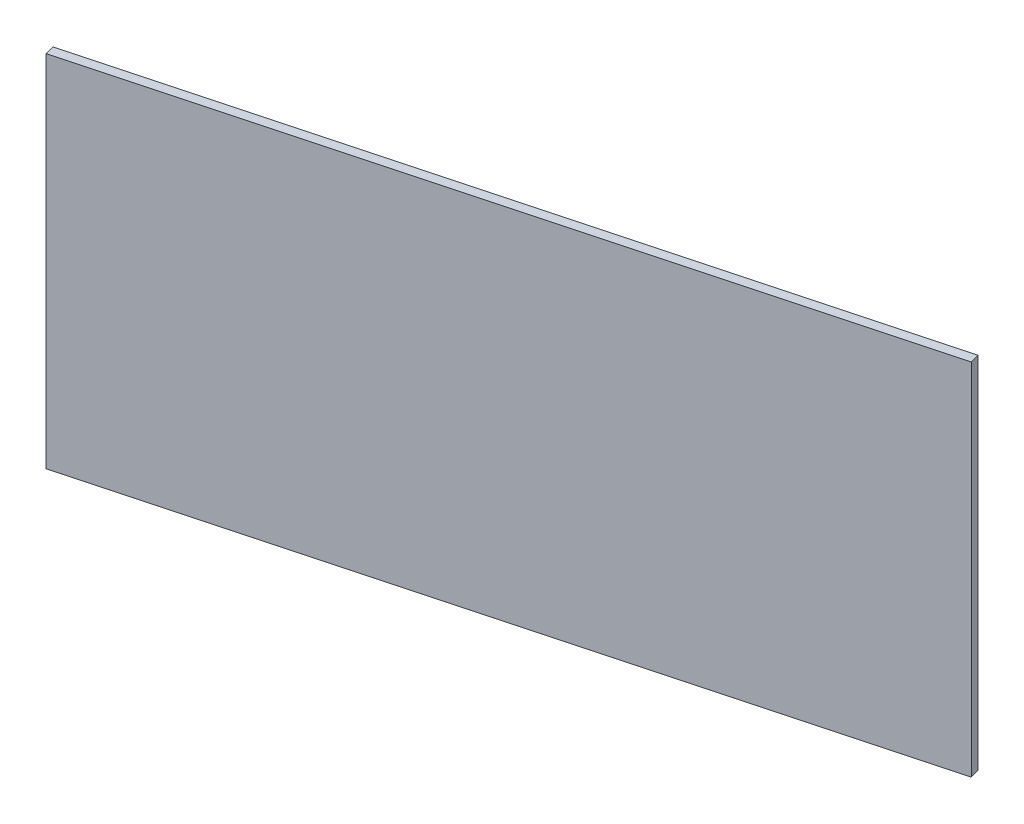
ISO-10303-21;
HEADER;
FILE_DESCRIPTION(('STEP AP214'),'2;1');
FILE_NAME('part.step','',(''),(''),'','','');
FILE_SCHEMA(('AUTOMOTIVE_DESIGN { 1 0 10303 214 1 1 1 1 }'));
ENDSEC;
DATA;
#1=APPLICATION_CONTEXT('core data for automotive mechanical design processes');
#2=APPLICATION_PROTOCOL_DEFINITION('international standard','automotive_design',2000,#1);
#3=PRODUCT_CONTEXT('',#1,'mechanical');
#4=PRODUCT('Part','Part','',(#3));
#5=PRODUCT_RELATED_PRODUCT_CATEGORY('part','',(#4));
#6=PRODUCT_DEFINITION_FORMATION('','',#4);
#7=PRODUCT_DEFINITION_CONTEXT('part definition',#1,'design');
#8=PRODUCT_DEFINITION('design','',#6,#7);
#9=PRODUCT_DEFINITION_SHAPE('','',#8);
#10=(LENGTH_UNIT() NAMED_UNIT(*) SI_UNIT(.MILLI.,.METRE.));
#11=(NAMED_UNIT(*) PLANE_ANGLE_UNIT() SI_UNIT($,.RADIAN.));
#12=(NAMED_UNIT(*) SI_UNIT($,.STERADIAN.) SOLID_ANGLE_UNIT());
#13=UNCERTAINTY_MEASURE_WITH_UNIT(LENGTH_MEASURE(1.E-05),#10,'distance_accuracy_value','');
#14=(GEOMETRIC_REPRESENTATION_CONTEXT(3) GLOBAL_UNCERTAINTY_ASSIGNED_CONTEXT((#13)) GLOBAL_UNIT_ASSIGNED_CONTEXT((#10,
#11,#12)) REPRESENTATION_CONTEXT('',''));
#15=CARTESIAN_POINT('',(0.,0.,0.));
#16=DIRECTION('',(0.,0.,1.));
#17=DIRECTION('',(1.,0.,0.));
#18=AXIS2_PLACEMENT_3D('',#15,#16,#17);
#19=CARTESIAN_POINT('',(13.541543939428,-1721.,3009.138921883));
#20=DIRECTION('',(0.258819045102985,0.,0.965925826288944));
#21=DIRECTION('',(0.,-1.,0.));
#22=AXIS2_PLACEMENT_3D('',#19,#20,#21);
#23=PLANE('',#22);
#24=DIRECTION('',(0.,1.,0.));
#25=VECTOR('',#24,1.);
#26=CARTESIAN_POINT('',(13.541543939428,-1721.,3009.138921883));
#27=LINE('',#26,#25);
#28=CARTESIAN_POINT('',(13.541543939428,-1721.,3009.138921883));
#29=VERTEX_POINT('',#28);
#30=CARTESIAN_POINT('',(13.541543939428,-587.,3009.138921883));
#31=VERTEX_POINT('',#30);
#32=EDGE_CURVE('E75',#29,#31,#27,.T.);
#33=ORIENTED_EDGE('',*,*,#32,.F.);
#34=DIRECTION('',(0.965925826288944,0.,-0.258819045102985));
#35=VECTOR('',#34,1.);
#36=CARTESIAN_POINT('',(13.541543939428,-1721.,3009.138921883));
#37=LINE('',#36,#35);
#38=CARTESIAN_POINT('',(2314.37686216,-1721.,2392.631956449));
#39=VERTEX_POINT('',#38);
#40=EDGE_CURVE('E70',#29,#39,#37,.T.);
#41=ORIENTED_EDGE('',*,*,#40,.T.);
#42=DIRECTION('',(0.,1.,0.));
#43=VECTOR('',#42,1.);
#44=CARTESIAN_POINT('',(2314.37686216,-1721.,2392.631956449));
#45=LINE('',#44,#43);
#46=CARTESIAN_POINT('',(2314.37686216,-587.,2392.631956449));
#47=VERTEX_POINT('',#46);
#48=EDGE_CURVE('E72',#39,#47,#45,.T.);
#49=ORIENTED_EDGE('',*,*,#48,.T.);
#50=DIRECTION('',(0.965925826288944,0.,-0.258819045102985));
#51=VECTOR('',#50,1.);
#52=CARTESIAN_POINT('',(13.541543939428,-587.,3009.138921883));
#53=LINE('',#52,#51);
#54=EDGE_CURVE('E11',#31,#47,#53,.T.);
#55=ORIENTED_EDGE('',*,*,#54,.F.);
#56=EDGE_LOOP('',(#33,#41,#49,#55));
#57=FACE_BOUND('',#56,.T.);
#58=ADVANCED_FACE('F17',(#57),#23,.T.);
#59=CARTESIAN_POINT('',(5.776972586353,-1721.,2980.161147095));
#60=DIRECTION('',(0.258819045102985,0.,0.965925826288944));
#61=DIRECTION('',(0.,-1.,0.));
#62=AXIS2_PLACEMENT_3D('',#59,#60,#61);
#63=PLANE('',#62);
#64=DIRECTION('',(0.965925826288944,0.,-0.258819045102985));
#65=VECTOR('',#64,1.);
#66=CARTESIAN_POINT('',(5.776972586353,-587.,2980.161147095));
#67=LINE('',#66,#65);
#68=CARTESIAN_POINT('',(5.776972586353,-587.,2980.161147095));
#69=VERTEX_POINT('',#68);
#70=CARTESIAN_POINT('',(2306.612290807,-587.,2363.654181661));
#71=VERTEX_POINT('',#70);
#72=EDGE_CURVE('E26',#69,#71,#67,.T.);
#73=ORIENTED_EDGE('',*,*,#72,.T.);
#74=DIRECTION('',(0.,1.,0.));
#75=VECTOR('',#74,1.);
#76=CARTESIAN_POINT('',(2306.612290807,-1721.,2363.654181661));
#77=LINE('',#76,#75);
#78=CARTESIAN_POINT('',(2306.612290807,-1721.,2363.654181661));
#79=VERTEX_POINT('',#78);
#80=EDGE_CURVE('E89',#79,#71,#77,.T.);
#81=ORIENTED_EDGE('',*,*,#80,.F.);
#82=DIRECTION('',(0.965925826288944,0.,-0.258819045102985));
#83=VECTOR('',#82,1.);
#84=CARTESIAN_POINT('',(5.776972586353,-1721.,2980.161147095));
#85=LINE('',#84,#83);
#86=CARTESIAN_POINT('',(5.776972586353,-1721.,2980.161147095));
#87=VERTEX_POINT('',#86);
#88=EDGE_CURVE('E62',#87,#79,#85,.T.);
#89=ORIENTED_EDGE('',*,*,#88,.F.);
#90=DIRECTION('',(0.,1.,0.));
#91=VECTOR('',#90,1.);
#92=CARTESIAN_POINT('',(5.776972586353,-1721.,2980.161147095));
#93=LINE('',#92,#91);
#94=EDGE_CURVE('E96',#87,#69,#93,.T.);
#95=ORIENTED_EDGE('',*,*,#94,.T.);
#96=EDGE_LOOP('',(#73,#81,#89,#95));
#97=FACE_BOUND('',#96,.T.);
#98=ADVANCED_FACE('F128',(#97),#63,.F.);
#99=CARTESIAN_POINT('',(5.776972586353,-587.,2980.161147095));
#100=DIRECTION('',(0.,1.,0.));
#101=DIRECTION('',(1.,0.,0.));
#102=AXIS2_PLACEMENT_3D('',#99,#100,#101);
#103=PLANE('',#102);
#104=ORIENTED_EDGE('',*,*,#72,.F.);
#105=DIRECTION('',(0.258819045102985,0.,0.965925826288944));
#106=VECTOR('',#105,1.);
#107=CARTESIAN_POINT('',(5.776972586353,-587.,2980.161147095));
#108=LINE('',#107,#106);
#109=EDGE_CURVE('E110',#69,#31,#108,.T.);
#110=ORIENTED_EDGE('',*,*,#109,.T.);
#111=ORIENTED_EDGE('',*,*,#54,.T.);
#112=DIRECTION('',(0.258819045102985,0.,0.965925826288944));
#113=VECTOR('',#112,1.);
#114=CARTESIAN_POINT('',(2306.612290807,-587.,2363.654181661));
#115=LINE('',#114,#113);
#116=EDGE_CURVE('E84',#71,#47,#115,.T.);
#117=ORIENTED_EDGE('',*,*,#116,.F.);
#118=EDGE_LOOP('',(#104,#110,#111,#117));
#119=FACE_BOUND('',#118,.T.);
#120=ADVANCED_FACE('F116',(#119),#103,.T.);
#121=CARTESIAN_POINT('',(5.776972586353,-1721.,2980.161147095));
#122=DIRECTION('',(0.,1.,0.));
#123=DIRECTION('',(1.,0.,0.));
#124=AXIS2_PLACEMENT_3D('',#121,#122,#123);
#125=PLANE('',#124);
#126=DIRECTION('',(0.258819045102985,0.,0.965925826288944));
#127=VECTOR('',#126,1.);
#128=CARTESIAN_POINT('',(2306.612290807,-1721.,2363.654181661));
#129=LINE('',#128,#127);
#130=EDGE_CURVE('E83',#79,#39,#129,.T.);
#131=ORIENTED_EDGE('',*,*,#130,.T.);
#132=ORIENTED_EDGE('',*,*,#40,.F.);
#133=DIRECTION('',(0.258819045102985,0.,0.965925826288944));
#134=VECTOR('',#133,1.);
#135=CARTESIAN_POINT('',(5.776972586353,-1721.,2980.161147095));
#136=LINE('',#135,#134);
#137=EDGE_CURVE('E90',#87,#29,#136,.T.);
#138=ORIENTED_EDGE('',*,*,#137,.F.);
#139=ORIENTED_EDGE('',*,*,#88,.T.);
#140=EDGE_LOOP('',(#131,#132,#138,#139));
#141=FACE_BOUND('',#140,.T.);
#142=ADVANCED_FACE('F87',(#141),#125,.F.);
#143=CARTESIAN_POINT('',(2306.612290807,-1721.,2363.654181661));
#144=DIRECTION('',(0.965925826288944,0.,-0.258819045102985));
#145=DIRECTION('',(0.,-1.,0.));
#146=AXIS2_PLACEMENT_3D('',#143,#144,#145);
#147=PLANE('',#146);
#148=ORIENTED_EDGE('',*,*,#130,.F.);
#149=ORIENTED_EDGE('',*,*,#80,.T.);
#150=ORIENTED_EDGE('',*,*,#116,.T.);
#151=ORIENTED_EDGE('',*,*,#48,.F.);
#152=EDGE_LOOP('',(#148,#149,#150,#151));
#153=FACE_BOUND('',#152,.T.);
#154=ADVANCED_FACE('F81',(#153),#147,.T.);
#155=CARTESIAN_POINT('',(5.776972586353,-1721.,2980.161147095));
#156=DIRECTION('',(0.965925826288944,0.,-0.258819045102985));
#157=DIRECTION('',(0.,-1.,0.));
#158=AXIS2_PLACEMENT_3D('',#155,#156,#157);
#159=PLANE('',#158);
#160=ORIENTED_EDGE('',*,*,#32,.T.);
#161=ORIENTED_EDGE('',*,*,#109,.F.);
#162=ORIENTED_EDGE('',*,*,#94,.F.);
#163=ORIENTED_EDGE('',*,*,#137,.T.);
#164=EDGE_LOOP('',(#160,#161,#162,#163));
#165=FACE_BOUND('',#164,.T.);
#166=ADVANCED_FACE('F119',(#165),#159,.F.);
#167=CLOSED_SHELL('',(#58,#98,#120,#142,#154,#166));
#168=MANIFOLD_SOLID_BREP('B1',#167);
#169=ADVANCED_BREP_SHAPE_REPRESENTATION('',(#18,#168),#14);
#170=SHAPE_DEFINITION_REPRESENTATION(#9,#169);
ENDSEC;
END-ISO-10303-21;
